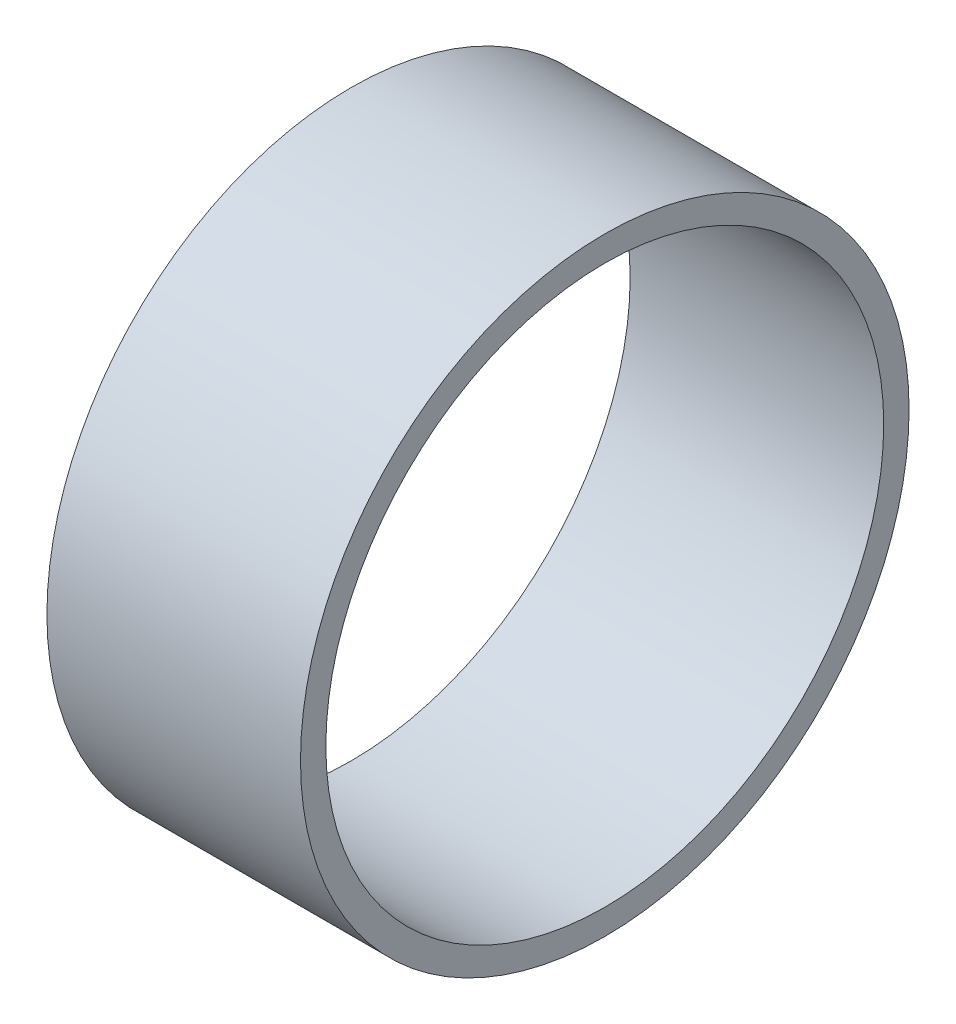
ISO-10303-21;
HEADER;
FILE_DESCRIPTION(('STEP AP214'),'2;1');
FILE_NAME('part.step','',(''),(''),'','','');
FILE_SCHEMA(('AUTOMOTIVE_DESIGN { 1 0 10303 214 1 1 1 1 }'));
ENDSEC;
DATA;
#1=APPLICATION_CONTEXT('core data for automotive mechanical design processes');
#2=APPLICATION_PROTOCOL_DEFINITION('international standard','automotive_design',2000,#1);
#3=PRODUCT_CONTEXT('',#1,'mechanical');
#4=PRODUCT('Part','Part','',(#3));
#5=PRODUCT_RELATED_PRODUCT_CATEGORY('part','',(#4));
#6=PRODUCT_DEFINITION_FORMATION('','',#4);
#7=PRODUCT_DEFINITION_CONTEXT('part definition',#1,'design');
#8=PRODUCT_DEFINITION('design','',#6,#7);
#9=PRODUCT_DEFINITION_SHAPE('','',#8);
#10=(LENGTH_UNIT() NAMED_UNIT(*) SI_UNIT(.MILLI.,.METRE.));
#11=(NAMED_UNIT(*) PLANE_ANGLE_UNIT() SI_UNIT($,.RADIAN.));
#12=(NAMED_UNIT(*) SI_UNIT($,.STERADIAN.) SOLID_ANGLE_UNIT());
#13=UNCERTAINTY_MEASURE_WITH_UNIT(LENGTH_MEASURE(1.E-05),#10,'distance_accuracy_value','');
#14=(GEOMETRIC_REPRESENTATION_CONTEXT(3) GLOBAL_UNCERTAINTY_ASSIGNED_CONTEXT((#13)) GLOBAL_UNIT_ASSIGNED_CONTEXT((#10,
#11,#12)) REPRESENTATION_CONTEXT('',''));
#15=CARTESIAN_POINT('',(0.,0.,0.));
#16=DIRECTION('',(0.,0.,1.));
#17=DIRECTION('',(1.,0.,0.));
#18=AXIS2_PLACEMENT_3D('',#15,#16,#17);
#19=CARTESIAN_POINT('',(63.5,139.7,0.));
#20=DIRECTION('',(-1.,0.,0.));
#21=DIRECTION('',(0.,0.,1.));
#22=AXIS2_PLACEMENT_3D('',#19,#20,#21);
#23=PLANE('',#22);
#24=CARTESIAN_POINT('',(63.5,0.,0.));
#25=DIRECTION('',(-1.,0.,0.));
#26=DIRECTION('',(0.,0.,1.));
#27=AXIS2_PLACEMENT_3D('',#24,#25,#26);
#28=CIRCLE('',#27,152.4);
#29=CARTESIAN_POINT('',(63.5,0.,152.4));
#30=VERTEX_POINT('',#29);
#31=EDGE_CURVE('E51',#30,#30,#28,.T.);
#32=ORIENTED_EDGE('',*,*,#31,.F.);
#33=EDGE_LOOP('',(#32));
#34=FACE_BOUND('',#33,.T.);
#35=CARTESIAN_POINT('',(63.5,0.,0.));
#36=DIRECTION('',(-1.,0.,0.));
#37=DIRECTION('',(0.,0.,1.));
#38=AXIS2_PLACEMENT_3D('',#35,#36,#37);
#39=CIRCLE('',#38,139.7);
#40=CARTESIAN_POINT('',(63.5,0.,139.7));
#41=VERTEX_POINT('',#40);
#42=EDGE_CURVE('E10',#41,#41,#39,.T.);
#43=ORIENTED_EDGE('',*,*,#42,.T.);
#44=EDGE_LOOP('',(#43));
#45=FACE_BOUND('',#44,.T.);
#46=ADVANCED_FACE('F37',(#34,#45),#23,.F.);
#47=CARTESIAN_POINT('',(0.,0.,0.));
#48=DIRECTION('',(-1.,0.,0.));
#49=DIRECTION('',(0.,0.,1.));
#50=AXIS2_PLACEMENT_3D('',#47,#48,#49);
#51=CYLINDRICAL_SURFACE('',#50,139.7);
#52=ORIENTED_EDGE('',*,*,#42,.F.);
#53=EDGE_LOOP('',(#52));
#54=FACE_BOUND('',#53,.T.);
#55=CARTESIAN_POINT('',(-63.5,0.,0.));
#56=DIRECTION('',(-1.,0.,0.));
#57=DIRECTION('',(0.,0.,1.));
#58=AXIS2_PLACEMENT_3D('',#55,#56,#57);
#59=CIRCLE('',#58,139.7);
#60=CARTESIAN_POINT('',(-63.5,0.,139.7));
#61=VERTEX_POINT('',#60);
#62=EDGE_CURVE('E43',#61,#61,#59,.T.);
#63=ORIENTED_EDGE('',*,*,#62,.T.);
#64=EDGE_LOOP('',(#63));
#65=FACE_BOUND('',#64,.T.);
#66=ADVANCED_FACE('F60',(#54,#65),#51,.F.);
#67=CARTESIAN_POINT('',(-63.5,139.7,0.));
#68=DIRECTION('',(1.,0.,0.));
#69=DIRECTION('',(0.,0.,-1.));
#70=AXIS2_PLACEMENT_3D('',#67,#68,#69);
#71=PLANE('',#70);
#72=ORIENTED_EDGE('',*,*,#62,.F.);
#73=EDGE_LOOP('',(#72));
#74=FACE_BOUND('',#73,.T.);
#75=CARTESIAN_POINT('',(-63.5,0.,0.));
#76=DIRECTION('',(-1.,0.,0.));
#77=DIRECTION('',(0.,0.,1.));
#78=AXIS2_PLACEMENT_3D('',#75,#76,#77);
#79=CIRCLE('',#78,152.4);
#80=CARTESIAN_POINT('',(-63.5,0.,152.4));
#81=VERTEX_POINT('',#80);
#82=EDGE_CURVE('E47',#81,#81,#79,.T.);
#83=ORIENTED_EDGE('',*,*,#82,.T.);
#84=EDGE_LOOP('',(#83));
#85=FACE_BOUND('',#84,.T.);
#86=ADVANCED_FACE('F64',(#74,#85),#71,.F.);
#87=CARTESIAN_POINT('',(0.,0.,0.));
#88=DIRECTION('',(-1.,0.,0.));
#89=DIRECTION('',(0.,0.,1.));
#90=AXIS2_PLACEMENT_3D('',#87,#88,#89);
#91=CYLINDRICAL_SURFACE('',#90,152.4);
#92=ORIENTED_EDGE('',*,*,#82,.F.);
#93=EDGE_LOOP('',(#92));
#94=FACE_BOUND('',#93,.T.);
#95=ORIENTED_EDGE('',*,*,#31,.T.);
#96=EDGE_LOOP('',(#95));
#97=FACE_BOUND('',#96,.T.);
#98=ADVANCED_FACE('F57',(#94,#97),#91,.T.);
#99=CLOSED_SHELL('',(#46,#66,#86,#98));
#100=MANIFOLD_SOLID_BREP('B2',#99);
#101=ADVANCED_BREP_SHAPE_REPRESENTATION('',(#18,#100),#14);
#102=SHAPE_DEFINITION_REPRESENTATION(#9,#101);
ENDSEC;
END-ISO-10303-21;
